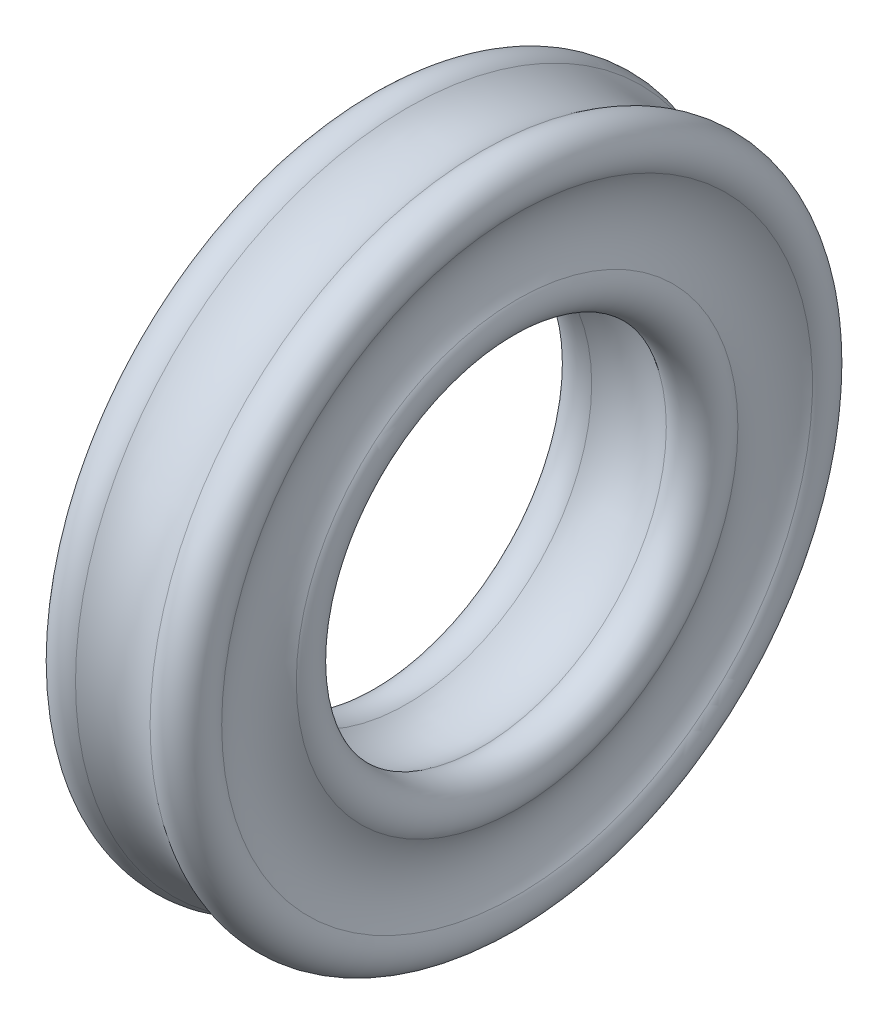
ISO-10303-21;
HEADER;
FILE_DESCRIPTION(('STEP AP214'),'2;1');
FILE_NAME('part.step','',(''),(''),'','','');
FILE_SCHEMA(('AUTOMOTIVE_DESIGN { 1 0 10303 214 1 1 1 1 }'));
ENDSEC;
DATA;
#1=APPLICATION_CONTEXT('core data for automotive mechanical design processes');
#2=APPLICATION_PROTOCOL_DEFINITION('international standard','automotive_design',2000,#1);
#3=PRODUCT_CONTEXT('',#1,'mechanical');
#4=PRODUCT('Part','Part','',(#3));
#5=PRODUCT_RELATED_PRODUCT_CATEGORY('part','',(#4));
#6=PRODUCT_DEFINITION_FORMATION('','',#4);
#7=PRODUCT_DEFINITION_CONTEXT('part definition',#1,'design');
#8=PRODUCT_DEFINITION('design','',#6,#7);
#9=PRODUCT_DEFINITION_SHAPE('','',#8);
#10=(LENGTH_UNIT() NAMED_UNIT(*) SI_UNIT(.MILLI.,.METRE.));
#11=(NAMED_UNIT(*) PLANE_ANGLE_UNIT() SI_UNIT($,.RADIAN.));
#12=(NAMED_UNIT(*) SI_UNIT($,.STERADIAN.) SOLID_ANGLE_UNIT());
#13=UNCERTAINTY_MEASURE_WITH_UNIT(LENGTH_MEASURE(1.E-05),#10,'distance_accuracy_value','');
#14=(GEOMETRIC_REPRESENTATION_CONTEXT(3) GLOBAL_UNCERTAINTY_ASSIGNED_CONTEXT((#13)) GLOBAL_UNIT_ASSIGNED_CONTEXT((#10,
#11,#12)) REPRESENTATION_CONTEXT('',''));
#15=CARTESIAN_POINT('',(0.,0.,0.));
#16=DIRECTION('',(0.,0.,1.));
#17=DIRECTION('',(1.,0.,0.));
#18=AXIS2_PLACEMENT_3D('',#15,#16,#17);
#19=CARTESIAN_POINT('',(40.,0.,0.));
#20=DIRECTION('',(-1.,0.,0.));
#21=DIRECTION('',(0.,0.,1.));
#22=AXIS2_PLACEMENT_3D('',#19,#20,#21);
#23=TOROIDAL_SURFACE('',#22,240.,20.);
#24=CARTESIAN_POINT('',(28.9059960754954,0.,0.));
#25=DIRECTION('',(-1.,0.,0.));
#26=DIRECTION('',(0.,0.,1.));
#27=AXIS2_PLACEMENT_3D('',#24,#25,#26);
#28=CIRCLE('',#27,256.641005886757);
#29=CARTESIAN_POINT('',(28.9059960754954,0.,256.641005886757));
#30=VERTEX_POINT('',#29);
#31=EDGE_CURVE('E56',#30,#30,#28,.T.);
#32=ORIENTED_EDGE('',*,*,#31,.F.);
#33=EDGE_LOOP('',(#32));
#34=FACE_BOUND('',#33,.T.);
#35=CARTESIAN_POINT('',(56.6410058867569,0.,0.));
#36=DIRECTION('',(-1.,0.,0.));
#37=DIRECTION('',(0.,0.,1.));
#38=AXIS2_PLACEMENT_3D('',#35,#36,#37);
#39=CIRCLE('',#38,228.905996075495);
#40=CARTESIAN_POINT('',(56.6410058867569,0.,228.905996075495));
#41=VERTEX_POINT('',#40);
#42=EDGE_CURVE('E10',#41,#41,#39,.T.);
#43=ORIENTED_EDGE('',*,*,#42,.T.);
#44=EDGE_LOOP('',(#43));
#45=FACE_BOUND('',#44,.T.);
#46=ADVANCED_FACE('F28',(#34,#45),#23,.T.);
#47=CARTESIAN_POINT('',(100.,0.,0.));
#48=DIRECTION('',(-1.,0.,0.));
#49=DIRECTION('',(0.,0.,1.));
#50=AXIS2_PLACEMENT_3D('',#47,#48,#49);
#51=TOROIDAL_SURFACE('',#50,200.,52.1110255092798);
#52=ORIENTED_EDGE('',*,*,#42,.F.);
#53=EDGE_LOOP('',(#52));
#54=FACE_BOUND('',#53,.T.);
#55=CARTESIAN_POINT('',(56.6410058867569,0.,0.));
#56=DIRECTION('',(-1.,0.,0.));
#57=DIRECTION('',(0.,0.,1.));
#58=AXIS2_PLACEMENT_3D('',#55,#56,#57);
#59=CIRCLE('',#58,171.094003924505);
#60=CARTESIAN_POINT('',(56.6410058867569,0.,171.094003924505));
#61=VERTEX_POINT('',#60);
#62=EDGE_CURVE('E34',#61,#61,#59,.T.);
#63=ORIENTED_EDGE('',*,*,#62,.T.);
#64=EDGE_LOOP('',(#63));
#65=FACE_BOUND('',#64,.T.);
#66=ADVANCED_FACE('F63',(#54,#65),#51,.F.);
#67=CARTESIAN_POINT('',(40.,0.,0.));
#68=DIRECTION('',(-1.,0.,0.));
#69=DIRECTION('',(0.,0.,1.));
#70=AXIS2_PLACEMENT_3D('',#67,#68,#69);
#71=TOROIDAL_SURFACE('',#70,160.,20.);
#72=ORIENTED_EDGE('',*,*,#62,.F.);
#73=EDGE_LOOP('',(#72));
#74=FACE_BOUND('',#73,.T.);
#75=CARTESIAN_POINT('',(28.9059960754954,0.,0.));
#76=DIRECTION('',(-1.,0.,0.));
#77=DIRECTION('',(0.,0.,1.));
#78=AXIS2_PLACEMENT_3D('',#75,#76,#77);
#79=CIRCLE('',#78,143.358994113243);
#80=CARTESIAN_POINT('',(28.9059960754954,0.,143.358994113243));
#81=VERTEX_POINT('',#80);
#82=EDGE_CURVE('E38',#81,#81,#79,.T.);
#83=ORIENTED_EDGE('',*,*,#82,.T.);
#84=EDGE_LOOP('',(#83));
#85=FACE_BOUND('',#84,.T.);
#86=ADVANCED_FACE('F67',(#74,#85),#71,.T.);
#87=CARTESIAN_POINT('',(0.,0.,0.));
#88=DIRECTION('',(-1.,0.,0.));
#89=DIRECTION('',(0.,0.,1.));
#90=AXIS2_PLACEMENT_3D('',#87,#88,#89);
#91=TOROIDAL_SURFACE('',#90,100.,52.1110255092798);
#92=ORIENTED_EDGE('',*,*,#82,.F.);
#93=EDGE_LOOP('',(#92));
#94=FACE_BOUND('',#93,.T.);
#95=CARTESIAN_POINT('',(-28.9059960754954,0.,0.));
#96=DIRECTION('',(-1.,0.,0.));
#97=DIRECTION('',(0.,0.,1.));
#98=AXIS2_PLACEMENT_3D('',#95,#96,#97);
#99=CIRCLE('',#98,143.358994113243);
#100=CARTESIAN_POINT('',(-28.9059960754954,0.,143.358994113243));
#101=VERTEX_POINT('',#100);
#102=EDGE_CURVE('E42',#101,#101,#99,.T.);
#103=ORIENTED_EDGE('',*,*,#102,.T.);
#104=EDGE_LOOP('',(#103));
#105=FACE_BOUND('',#104,.T.);
#106=ADVANCED_FACE('F72',(#94,#105),#91,.F.);
#107=CARTESIAN_POINT('',(-40.,0.,0.));
#108=DIRECTION('',(-1.,0.,0.));
#109=DIRECTION('',(0.,0.,1.));
#110=AXIS2_PLACEMENT_3D('',#107,#108,#109);
#111=TOROIDAL_SURFACE('',#110,160.,20.);
#112=ORIENTED_EDGE('',*,*,#102,.F.);
#113=EDGE_LOOP('',(#112));
#114=FACE_BOUND('',#113,.T.);
#115=CARTESIAN_POINT('',(-56.6410058867569,0.,0.));
#116=DIRECTION('',(-1.,0.,0.));
#117=DIRECTION('',(0.,0.,1.));
#118=AXIS2_PLACEMENT_3D('',#115,#116,#117);
#119=CIRCLE('',#118,171.094003924505);
#120=CARTESIAN_POINT('',(-56.6410058867569,0.,171.094003924505));
#121=VERTEX_POINT('',#120);
#122=EDGE_CURVE('E47',#121,#121,#119,.T.);
#123=ORIENTED_EDGE('',*,*,#122,.T.);
#124=EDGE_LOOP('',(#123));
#125=FACE_BOUND('',#124,.T.);
#126=ADVANCED_FACE('F78',(#114,#125),#111,.T.);
#127=CARTESIAN_POINT('',(-100.,0.,0.));
#128=DIRECTION('',(-1.,0.,0.));
#129=DIRECTION('',(0.,0.,1.));
#130=AXIS2_PLACEMENT_3D('',#127,#128,#129);
#131=TOROIDAL_SURFACE('',#130,200.,52.1110255092798);
#132=ORIENTED_EDGE('',*,*,#122,.F.);
#133=EDGE_LOOP('',(#132));
#134=FACE_BOUND('',#133,.T.);
#135=CARTESIAN_POINT('',(-56.6410058867569,0.,0.));
#136=DIRECTION('',(-1.,0.,0.));
#137=DIRECTION('',(0.,0.,1.));
#138=AXIS2_PLACEMENT_3D('',#135,#136,#137);
#139=CIRCLE('',#138,228.905996075495);
#140=CARTESIAN_POINT('',(-56.6410058867569,0.,228.905996075495));
#141=VERTEX_POINT('',#140);
#142=EDGE_CURVE('E50',#141,#141,#139,.T.);
#143=ORIENTED_EDGE('',*,*,#142,.T.);
#144=EDGE_LOOP('',(#143));
#145=FACE_BOUND('',#144,.T.);
#146=ADVANCED_FACE('F82',(#134,#145),#131,.F.);
#147=CARTESIAN_POINT('',(-40.,0.,0.));
#148=DIRECTION('',(-1.,0.,0.));
#149=DIRECTION('',(0.,0.,1.));
#150=AXIS2_PLACEMENT_3D('',#147,#148,#149);
#151=TOROIDAL_SURFACE('',#150,240.,20.);
#152=ORIENTED_EDGE('',*,*,#142,.F.);
#153=EDGE_LOOP('',(#152));
#154=FACE_BOUND('',#153,.T.);
#155=CARTESIAN_POINT('',(-28.9059960754955,0.,0.));
#156=DIRECTION('',(-1.,0.,0.));
#157=DIRECTION('',(0.,0.,1.));
#158=AXIS2_PLACEMENT_3D('',#155,#156,#157);
#159=CIRCLE('',#158,256.641005886757);
#160=CARTESIAN_POINT('',(-28.9059960754955,0.,256.641005886757));
#161=VERTEX_POINT('',#160);
#162=EDGE_CURVE('E53',#161,#161,#159,.T.);
#163=ORIENTED_EDGE('',*,*,#162,.T.);
#164=EDGE_LOOP('',(#163));
#165=FACE_BOUND('',#164,.T.);
#166=ADVANCED_FACE('F86',(#154,#165),#151,.T.);
#167=CARTESIAN_POINT('',(0.,0.,0.));
#168=DIRECTION('',(-1.,0.,0.));
#169=DIRECTION('',(0.,0.,1.));
#170=AXIS2_PLACEMENT_3D('',#167,#168,#169);
#171=TOROIDAL_SURFACE('',#170,300.,52.1110255092798);
#172=ORIENTED_EDGE('',*,*,#162,.F.);
#173=EDGE_LOOP('',(#172));
#174=FACE_BOUND('',#173,.T.);
#175=ORIENTED_EDGE('',*,*,#31,.T.);
#176=EDGE_LOOP('',(#175));
#177=FACE_BOUND('',#176,.T.);
#178=ADVANCED_FACE('F60',(#174,#177),#171,.F.);
#179=CLOSED_SHELL('',(#46,#66,#86,#106,#126,#146,#166,#178));
#180=MANIFOLD_SOLID_BREP('B2',#179);
#181=ADVANCED_BREP_SHAPE_REPRESENTATION('',(#18,#180),#14);
#182=SHAPE_DEFINITION_REPRESENTATION(#9,#181);
ENDSEC;
END-ISO-10303-21;
